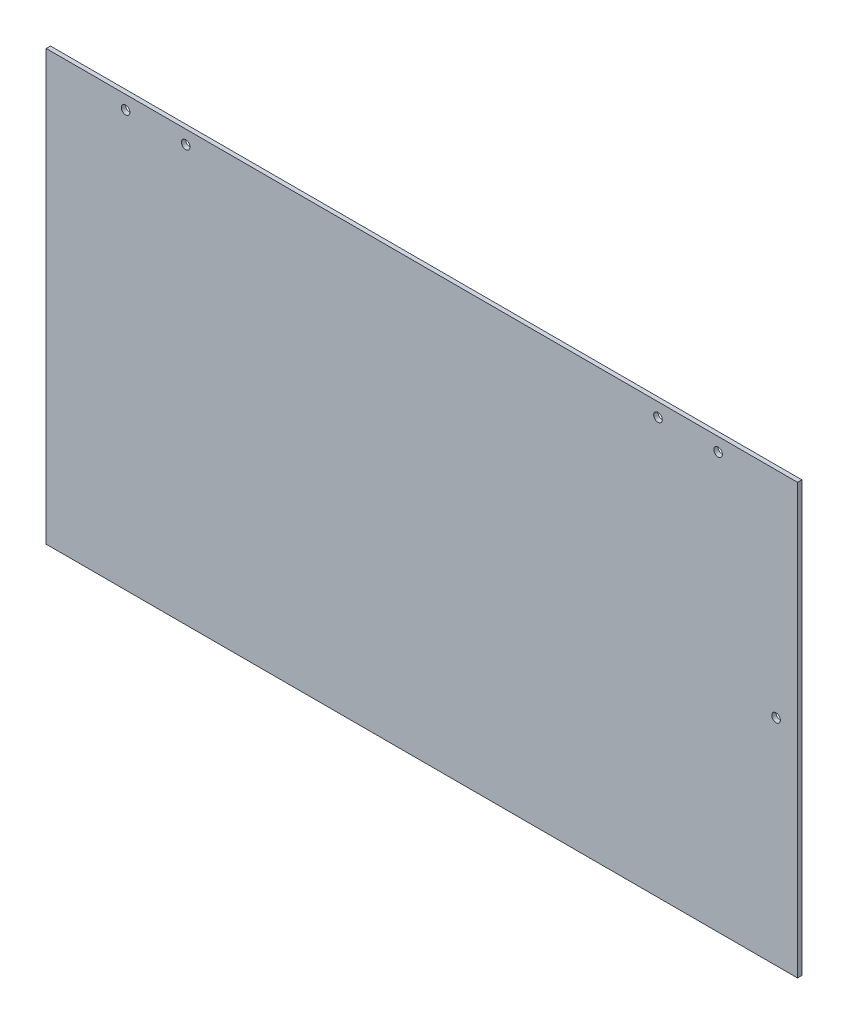
ISO-10303-21;
HEADER;
FILE_DESCRIPTION(('STEP AP214'),'2;1');
FILE_NAME('part.step','',(''),(''),'','','');
FILE_SCHEMA(('AUTOMOTIVE_DESIGN { 1 0 10303 214 1 1 1 1 }'));
ENDSEC;
DATA;
#1=APPLICATION_CONTEXT('core data for automotive mechanical design processes');
#2=APPLICATION_PROTOCOL_DEFINITION('international standard','automotive_design',2000,#1);
#3=PRODUCT_CONTEXT('',#1,'mechanical');
#4=PRODUCT('Part','Part','',(#3));
#5=PRODUCT_RELATED_PRODUCT_CATEGORY('part','',(#4));
#6=PRODUCT_DEFINITION_FORMATION('','',#4);
#7=PRODUCT_DEFINITION_CONTEXT('part definition',#1,'design');
#8=PRODUCT_DEFINITION('design','',#6,#7);
#9=PRODUCT_DEFINITION_SHAPE('','',#8);
#10=(LENGTH_UNIT() NAMED_UNIT(*) SI_UNIT(.MILLI.,.METRE.));
#11=(NAMED_UNIT(*) PLANE_ANGLE_UNIT() SI_UNIT($,.RADIAN.));
#12=(NAMED_UNIT(*) SI_UNIT($,.STERADIAN.) SOLID_ANGLE_UNIT());
#13=UNCERTAINTY_MEASURE_WITH_UNIT(LENGTH_MEASURE(1.E-05),#10,'distance_accuracy_value','');
#14=(GEOMETRIC_REPRESENTATION_CONTEXT(3) GLOBAL_UNCERTAINTY_ASSIGNED_CONTEXT((#13)) GLOBAL_UNIT_ASSIGNED_CONTEXT((#10,
#11,#12)) REPRESENTATION_CONTEXT('',''));
#15=CARTESIAN_POINT('',(0.,0.,0.));
#16=DIRECTION('',(0.,0.,1.));
#17=DIRECTION('',(1.,0.,0.));
#18=AXIS2_PLACEMENT_3D('',#15,#16,#17);
#19=CARTESIAN_POINT('',(0.,0.,2.));
#20=DIRECTION('',(0.,0.,1.));
#21=DIRECTION('',(1.,0.,0.));
#22=AXIS2_PLACEMENT_3D('',#19,#20,#21);
#23=PLANE('',#22);
#24=CARTESIAN_POINT('',(37.,-6.30000000000003,2.));
#25=DIRECTION('',(0.,0.,1.));
#26=DIRECTION('',(-1.,0.,0.));
#27=AXIS2_PLACEMENT_3D('',#24,#25,#26);
#28=CIRCLE('',#27,2.);
#29=CARTESIAN_POINT('',(35.,-6.30000000000003,2.));
#30=VERTEX_POINT('',#29);
#31=EDGE_CURVE('E130',#30,#30,#28,.T.);
#32=ORIENTED_EDGE('',*,*,#31,.F.);
#33=EDGE_LOOP('',(#32));
#34=FACE_BOUND('',#33,.T.);
#35=CARTESIAN_POINT('',(285.,-6.3,2.));
#36=DIRECTION('',(0.,0.,1.));
#37=DIRECTION('',(1.,0.,0.));
#38=AXIS2_PLACEMENT_3D('',#35,#36,#37);
#39=CIRCLE('',#38,2.);
#40=CARTESIAN_POINT('',(287.,-6.3,2.));
#41=VERTEX_POINT('',#40);
#42=EDGE_CURVE('E118',#41,#41,#39,.T.);
#43=ORIENTED_EDGE('',*,*,#42,.F.);
#44=EDGE_LOOP('',(#43));
#45=FACE_BOUND('',#44,.T.);
#46=DIRECTION('',(0.,-1.,0.));
#47=VECTOR('',#46,1.);
#48=CARTESIAN_POINT('',(0.,0.,2.));
#49=LINE('',#48,#47);
#50=CARTESIAN_POINT('',(0.,0.,2.));
#51=VERTEX_POINT('',#50);
#52=CARTESIAN_POINT('',(0.,-200.,2.));
#53=VERTEX_POINT('',#52);
#54=EDGE_CURVE('E88',#51,#53,#49,.T.);
#55=ORIENTED_EDGE('',*,*,#54,.T.);
#56=DIRECTION('',(1.,0.,0.));
#57=VECTOR('',#56,1.);
#58=CARTESIAN_POINT('',(0.,-200.,2.));
#59=LINE('',#58,#57);
#60=CARTESIAN_POINT('',(350.,-200.,2.));
#61=VERTEX_POINT('',#60);
#62=EDGE_CURVE('E83',#53,#61,#59,.T.);
#63=ORIENTED_EDGE('',*,*,#62,.T.);
#64=DIRECTION('',(0.,1.,0.));
#65=VECTOR('',#64,1.);
#66=CARTESIAN_POINT('',(350.,0.,2.));
#67=LINE('',#66,#65);
#68=CARTESIAN_POINT('',(350.,0.,2.));
#69=VERTEX_POINT('',#68);
#70=EDGE_CURVE('E86',#61,#69,#67,.T.);
#71=ORIENTED_EDGE('',*,*,#70,.T.);
#72=DIRECTION('',(-1.,0.,0.));
#73=VECTOR('',#72,1.);
#74=CARTESIAN_POINT('',(0.,0.,2.));
#75=LINE('',#74,#73);
#76=EDGE_CURVE('E53',#69,#51,#75,.T.);
#77=ORIENTED_EDGE('',*,*,#76,.T.);
#78=EDGE_LOOP('',(#55,#63,#71,#77));
#79=FACE_BOUND('',#78,.T.);
#80=CARTESIAN_POINT('',(340.,-100.,2.));
#81=DIRECTION('',(0.,0.,1.));
#82=DIRECTION('',(1.,0.,0.));
#83=AXIS2_PLACEMENT_3D('',#80,#81,#82);
#84=CIRCLE('',#83,2.);
#85=CARTESIAN_POINT('',(342.,-100.,2.));
#86=VERTEX_POINT('',#85);
#87=EDGE_CURVE('E103',#86,#86,#84,.T.);
#88=ORIENTED_EDGE('',*,*,#87,.F.);
#89=EDGE_LOOP('',(#88));
#90=FACE_BOUND('',#89,.T.);
#91=CARTESIAN_POINT('',(313.,-6.3,2.));
#92=DIRECTION('',(0.,0.,1.));
#93=DIRECTION('',(1.,0.,0.));
#94=AXIS2_PLACEMENT_3D('',#91,#92,#93);
#95=CIRCLE('',#94,2.);
#96=CARTESIAN_POINT('',(315.,-6.3,2.));
#97=VERTEX_POINT('',#96);
#98=EDGE_CURVE('E124',#97,#97,#95,.T.);
#99=ORIENTED_EDGE('',*,*,#98,.F.);
#100=EDGE_LOOP('',(#99));
#101=FACE_BOUND('',#100,.T.);
#102=CARTESIAN_POINT('',(65.,-6.30000000000003,2.));
#103=DIRECTION('',(0.,0.,1.));
#104=DIRECTION('',(-1.,0.,0.));
#105=AXIS2_PLACEMENT_3D('',#102,#103,#104);
#106=CIRCLE('',#105,2.);
#107=CARTESIAN_POINT('',(63.,-6.30000000000003,2.));
#108=VERTEX_POINT('',#107);
#109=EDGE_CURVE('E136',#108,#108,#106,.T.);
#110=ORIENTED_EDGE('',*,*,#109,.F.);
#111=EDGE_LOOP('',(#110));
#112=FACE_BOUND('',#111,.T.);
#113=ADVANCED_FACE('F36',(#34,#45,#79,#90,#101,#112),#23,.T.);
#114=CARTESIAN_POINT('',(0.,0.,0.));
#115=DIRECTION('',(0.,0.,1.));
#116=DIRECTION('',(1.,0.,0.));
#117=AXIS2_PLACEMENT_3D('',#114,#115,#116);
#118=PLANE('',#117);
#119=DIRECTION('',(0.,-1.,0.));
#120=VECTOR('',#119,1.);
#121=CARTESIAN_POINT('',(0.,0.,0.));
#122=LINE('',#121,#120);
#123=CARTESIAN_POINT('',(0.,0.,0.));
#124=VERTEX_POINT('',#123);
#125=CARTESIAN_POINT('',(0.,-200.,0.));
#126=VERTEX_POINT('',#125);
#127=EDGE_CURVE('E100',#124,#126,#122,.T.);
#128=ORIENTED_EDGE('',*,*,#127,.F.);
#129=DIRECTION('',(-1.,0.,0.));
#130=VECTOR('',#129,1.);
#131=CARTESIAN_POINT('',(0.,0.,0.));
#132=LINE('',#131,#130);
#133=CARTESIAN_POINT('',(350.,0.,0.));
#134=VERTEX_POINT('',#133);
#135=EDGE_CURVE('E76',#134,#124,#132,.T.);
#136=ORIENTED_EDGE('',*,*,#135,.F.);
#137=DIRECTION('',(0.,1.,0.));
#138=VECTOR('',#137,1.);
#139=CARTESIAN_POINT('',(350.,0.,0.));
#140=LINE('',#139,#138);
#141=CARTESIAN_POINT('',(350.,-200.,0.));
#142=VERTEX_POINT('',#141);
#143=EDGE_CURVE('E70',#142,#134,#140,.T.);
#144=ORIENTED_EDGE('',*,*,#143,.F.);
#145=DIRECTION('',(1.,0.,0.));
#146=VECTOR('',#145,1.);
#147=CARTESIAN_POINT('',(0.,-200.,0.));
#148=LINE('',#147,#146);
#149=EDGE_CURVE('E92',#126,#142,#148,.T.);
#150=ORIENTED_EDGE('',*,*,#149,.F.);
#151=EDGE_LOOP('',(#128,#136,#144,#150));
#152=FACE_BOUND('',#151,.T.);
#153=CARTESIAN_POINT('',(340.,-100.,0.));
#154=DIRECTION('',(0.,0.,1.));
#155=DIRECTION('',(1.,0.,0.));
#156=AXIS2_PLACEMENT_3D('',#153,#154,#155);
#157=CIRCLE('',#156,2.);
#158=CARTESIAN_POINT('',(342.,-100.,0.));
#159=VERTEX_POINT('',#158);
#160=EDGE_CURVE('E115',#159,#159,#157,.T.);
#161=ORIENTED_EDGE('',*,*,#160,.T.);
#162=EDGE_LOOP('',(#161));
#163=FACE_BOUND('',#162,.T.);
#164=CARTESIAN_POINT('',(285.,-6.3,0.));
#165=DIRECTION('',(0.,0.,1.));
#166=DIRECTION('',(1.,0.,0.));
#167=AXIS2_PLACEMENT_3D('',#164,#165,#166);
#168=CIRCLE('',#167,2.);
#169=CARTESIAN_POINT('',(287.,-6.3,0.));
#170=VERTEX_POINT('',#169);
#171=EDGE_CURVE('E121',#170,#170,#168,.T.);
#172=ORIENTED_EDGE('',*,*,#171,.T.);
#173=EDGE_LOOP('',(#172));
#174=FACE_BOUND('',#173,.T.);
#175=CARTESIAN_POINT('',(313.,-6.3,0.));
#176=DIRECTION('',(0.,0.,1.));
#177=DIRECTION('',(1.,0.,0.));
#178=AXIS2_PLACEMENT_3D('',#175,#176,#177);
#179=CIRCLE('',#178,2.);
#180=CARTESIAN_POINT('',(315.,-6.3,0.));
#181=VERTEX_POINT('',#180);
#182=EDGE_CURVE('E127',#181,#181,#179,.T.);
#183=ORIENTED_EDGE('',*,*,#182,.T.);
#184=EDGE_LOOP('',(#183));
#185=FACE_BOUND('',#184,.T.);
#186=CARTESIAN_POINT('',(37.,-6.30000000000003,0.));
#187=DIRECTION('',(0.,0.,1.));
#188=DIRECTION('',(-1.,0.,0.));
#189=AXIS2_PLACEMENT_3D('',#186,#187,#188);
#190=CIRCLE('',#189,2.);
#191=CARTESIAN_POINT('',(35.,-6.30000000000003,0.));
#192=VERTEX_POINT('',#191);
#193=EDGE_CURVE('E133',#192,#192,#190,.T.);
#194=ORIENTED_EDGE('',*,*,#193,.T.);
#195=EDGE_LOOP('',(#194));
#196=FACE_BOUND('',#195,.T.);
#197=CARTESIAN_POINT('',(65.,-6.30000000000003,0.));
#198=DIRECTION('',(0.,0.,1.));
#199=DIRECTION('',(-1.,0.,0.));
#200=AXIS2_PLACEMENT_3D('',#197,#198,#199);
#201=CIRCLE('',#200,2.);
#202=CARTESIAN_POINT('',(63.,-6.30000000000003,0.));
#203=VERTEX_POINT('',#202);
#204=EDGE_CURVE('E139',#203,#203,#201,.T.);
#205=ORIENTED_EDGE('',*,*,#204,.T.);
#206=EDGE_LOOP('',(#205));
#207=FACE_BOUND('',#206,.T.);
#208=ADVANCED_FACE('F111',(#152,#163,#174,#185,#196,#207),#118,.F.);
#209=CARTESIAN_POINT('',(0.,0.,2.));
#210=DIRECTION('',(1.,0.,0.));
#211=DIRECTION('',(0.,0.,-1.));
#212=AXIS2_PLACEMENT_3D('',#209,#210,#211);
#213=PLANE('',#212);
#214=ORIENTED_EDGE('',*,*,#127,.T.);
#215=DIRECTION('',(0.,0.,-1.));
#216=VECTOR('',#215,1.);
#217=CARTESIAN_POINT('',(0.,-200.,2.));
#218=LINE('',#217,#216);
#219=EDGE_CURVE('E11',#53,#126,#218,.T.);
#220=ORIENTED_EDGE('',*,*,#219,.F.);
#221=ORIENTED_EDGE('',*,*,#54,.F.);
#222=DIRECTION('',(0.,0.,-1.));
#223=VECTOR('',#222,1.);
#224=CARTESIAN_POINT('',(0.,0.,2.));
#225=LINE('',#224,#223);
#226=EDGE_CURVE('E96',#51,#124,#225,.T.);
#227=ORIENTED_EDGE('',*,*,#226,.T.);
#228=EDGE_LOOP('',(#214,#220,#221,#227));
#229=FACE_BOUND('',#228,.T.);
#230=ADVANCED_FACE('F38',(#229),#213,.F.);
#231=CARTESIAN_POINT('',(0.,-200.,2.));
#232=DIRECTION('',(0.,1.,0.));
#233=DIRECTION('',(0.,0.,1.));
#234=AXIS2_PLACEMENT_3D('',#231,#232,#233);
#235=PLANE('',#234);
#236=ORIENTED_EDGE('',*,*,#149,.T.);
#237=DIRECTION('',(0.,0.,-1.));
#238=VECTOR('',#237,1.);
#239=CARTESIAN_POINT('',(350.,-200.,2.));
#240=LINE('',#239,#238);
#241=EDGE_CURVE('E45',#61,#142,#240,.T.);
#242=ORIENTED_EDGE('',*,*,#241,.F.);
#243=ORIENTED_EDGE('',*,*,#62,.F.);
#244=ORIENTED_EDGE('',*,*,#219,.T.);
#245=EDGE_LOOP('',(#236,#242,#243,#244));
#246=FACE_BOUND('',#245,.T.);
#247=ADVANCED_FACE('F91',(#246),#235,.F.);
#248=CARTESIAN_POINT('',(350.,0.,2.));
#249=DIRECTION('',(-1.,0.,0.));
#250=DIRECTION('',(0.,0.,1.));
#251=AXIS2_PLACEMENT_3D('',#248,#249,#250);
#252=PLANE('',#251);
#253=ORIENTED_EDGE('',*,*,#143,.T.);
#254=DIRECTION('',(0.,0.,-1.));
#255=VECTOR('',#254,1.);
#256=CARTESIAN_POINT('',(350.,0.,2.));
#257=LINE('',#256,#255);
#258=EDGE_CURVE('E93',#69,#134,#257,.T.);
#259=ORIENTED_EDGE('',*,*,#258,.F.);
#260=ORIENTED_EDGE('',*,*,#70,.F.);
#261=ORIENTED_EDGE('',*,*,#241,.T.);
#262=EDGE_LOOP('',(#253,#259,#260,#261));
#263=FACE_BOUND('',#262,.T.);
#264=ADVANCED_FACE('F94',(#263),#252,.F.);
#265=CARTESIAN_POINT('',(0.,0.,2.));
#266=DIRECTION('',(0.,-1.,0.));
#267=DIRECTION('',(0.,0.,-1.));
#268=AXIS2_PLACEMENT_3D('',#265,#266,#267);
#269=PLANE('',#268);
#270=ORIENTED_EDGE('',*,*,#135,.T.);
#271=ORIENTED_EDGE('',*,*,#226,.F.);
#272=ORIENTED_EDGE('',*,*,#76,.F.);
#273=ORIENTED_EDGE('',*,*,#258,.T.);
#274=EDGE_LOOP('',(#270,#271,#272,#273));
#275=FACE_BOUND('',#274,.T.);
#276=ADVANCED_FACE('F108',(#275),#269,.F.);
#277=CARTESIAN_POINT('',(340.,-100.,2.));
#278=DIRECTION('',(0.,0.,-1.));
#279=DIRECTION('',(-1.,0.,0.));
#280=AXIS2_PLACEMENT_3D('',#277,#278,#279);
#281=CYLINDRICAL_SURFACE('',#280,2.);
#282=ORIENTED_EDGE('',*,*,#87,.T.);
#283=EDGE_LOOP('',(#282));
#284=FACE_BOUND('',#283,.T.);
#285=ORIENTED_EDGE('',*,*,#160,.F.);
#286=EDGE_LOOP('',(#285));
#287=FACE_BOUND('',#286,.T.);
#288=ADVANCED_FACE('F158',(#284,#287),#281,.F.);
#289=CARTESIAN_POINT('',(285.,-6.3,2.));
#290=DIRECTION('',(0.,0.,-1.));
#291=DIRECTION('',(-1.,0.,0.));
#292=AXIS2_PLACEMENT_3D('',#289,#290,#291);
#293=CYLINDRICAL_SURFACE('',#292,2.);
#294=ORIENTED_EDGE('',*,*,#42,.T.);
#295=EDGE_LOOP('',(#294));
#296=FACE_BOUND('',#295,.T.);
#297=ORIENTED_EDGE('',*,*,#171,.F.);
#298=EDGE_LOOP('',(#297));
#299=FACE_BOUND('',#298,.T.);
#300=ADVANCED_FACE('F206',(#296,#299),#293,.F.);
#301=CARTESIAN_POINT('',(313.,-6.3,2.));
#302=DIRECTION('',(0.,0.,-1.));
#303=DIRECTION('',(-1.,0.,0.));
#304=AXIS2_PLACEMENT_3D('',#301,#302,#303);
#305=CYLINDRICAL_SURFACE('',#304,2.);
#306=ORIENTED_EDGE('',*,*,#98,.T.);
#307=EDGE_LOOP('',(#306));
#308=FACE_BOUND('',#307,.T.);
#309=ORIENTED_EDGE('',*,*,#182,.F.);
#310=EDGE_LOOP('',(#309));
#311=FACE_BOUND('',#310,.T.);
#312=ADVANCED_FACE('F214',(#308,#311),#305,.F.);
#313=CARTESIAN_POINT('',(37.,-6.30000000000003,2.));
#314=DIRECTION('',(0.,0.,-1.));
#315=DIRECTION('',(-1.,0.,0.));
#316=AXIS2_PLACEMENT_3D('',#313,#314,#315);
#317=CYLINDRICAL_SURFACE('',#316,2.);
#318=ORIENTED_EDGE('',*,*,#31,.T.);
#319=EDGE_LOOP('',(#318));
#320=FACE_BOUND('',#319,.T.);
#321=ORIENTED_EDGE('',*,*,#193,.F.);
#322=EDGE_LOOP('',(#321));
#323=FACE_BOUND('',#322,.T.);
#324=ADVANCED_FACE('F222',(#320,#323),#317,.F.);
#325=CARTESIAN_POINT('',(65.,-6.30000000000003,2.));
#326=DIRECTION('',(0.,0.,-1.));
#327=DIRECTION('',(-1.,0.,0.));
#328=AXIS2_PLACEMENT_3D('',#325,#326,#327);
#329=CYLINDRICAL_SURFACE('',#328,2.);
#330=ORIENTED_EDGE('',*,*,#109,.T.);
#331=EDGE_LOOP('',(#330));
#332=FACE_BOUND('',#331,.T.);
#333=ORIENTED_EDGE('',*,*,#204,.F.);
#334=EDGE_LOOP('',(#333));
#335=FACE_BOUND('',#334,.T.);
#336=ADVANCED_FACE('F145',(#332,#335),#329,.F.);
#337=CLOSED_SHELL('',(#113,#208,#230,#247,#264,#276,#288,#300,#312,#324,#336));
#338=MANIFOLD_SOLID_BREP('B2',#337);
#339=ADVANCED_BREP_SHAPE_REPRESENTATION('',(#18,#338),#14);
#340=SHAPE_DEFINITION_REPRESENTATION(#9,#339);
ENDSEC;
END-ISO-10303-21;
